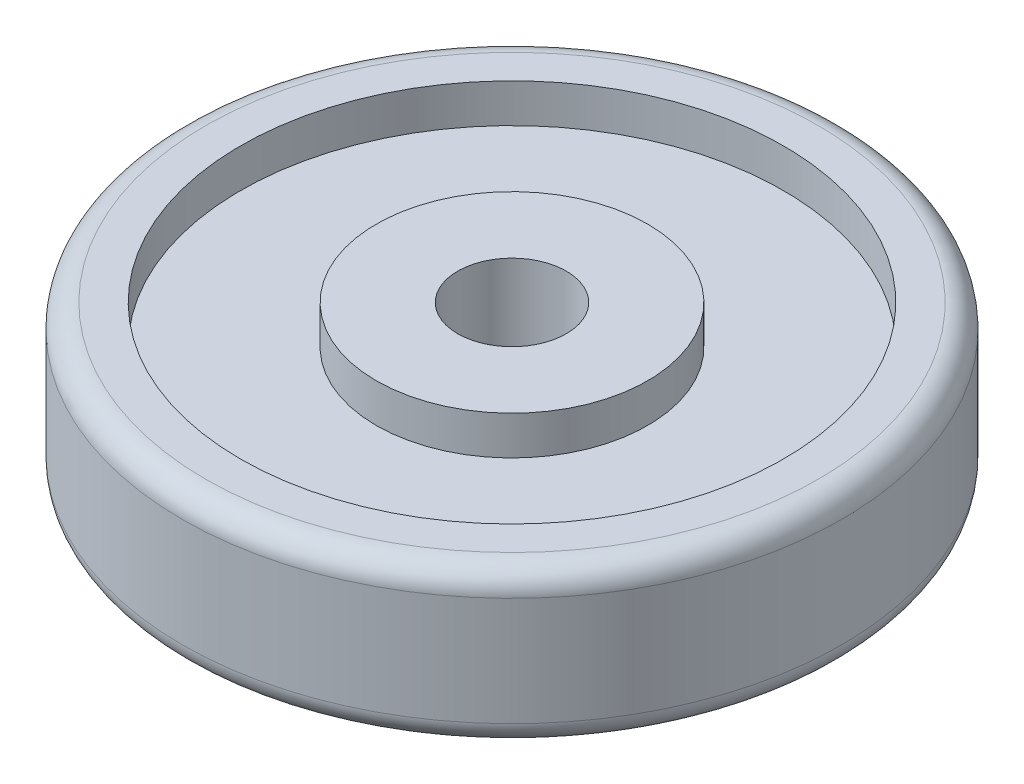
ISO-10303-21;
HEADER;
FILE_DESCRIPTION(('STEP AP214'),'2;1');
FILE_NAME('part.step','',(''),(''),'','','');
FILE_SCHEMA(('AUTOMOTIVE_DESIGN { 1 0 10303 214 1 1 1 1 }'));
ENDSEC;
DATA;
#1=APPLICATION_CONTEXT('core data for automotive mechanical design processes');
#2=APPLICATION_PROTOCOL_DEFINITION('international standard','automotive_design',2000,#1);
#3=PRODUCT_CONTEXT('',#1,'mechanical');
#4=PRODUCT('Part','Part','',(#3));
#5=PRODUCT_RELATED_PRODUCT_CATEGORY('part','',(#4));
#6=PRODUCT_DEFINITION_FORMATION('','',#4);
#7=PRODUCT_DEFINITION_CONTEXT('part definition',#1,'design');
#8=PRODUCT_DEFINITION('design','',#6,#7);
#9=PRODUCT_DEFINITION_SHAPE('','',#8);
#10=(LENGTH_UNIT() NAMED_UNIT(*) SI_UNIT(.MILLI.,.METRE.));
#11=(NAMED_UNIT(*) PLANE_ANGLE_UNIT() SI_UNIT($,.RADIAN.));
#12=(NAMED_UNIT(*) SI_UNIT($,.STERADIAN.) SOLID_ANGLE_UNIT());
#13=UNCERTAINTY_MEASURE_WITH_UNIT(LENGTH_MEASURE(1.E-05),#10,'distance_accuracy_value','');
#14=(GEOMETRIC_REPRESENTATION_CONTEXT(3) GLOBAL_UNCERTAINTY_ASSIGNED_CONTEXT((#13)) GLOBAL_UNIT_ASSIGNED_CONTEXT((#10,
#11,#12)) REPRESENTATION_CONTEXT('',''));
#15=CARTESIAN_POINT('',(0.,0.,0.));
#16=DIRECTION('',(0.,0.,1.));
#17=DIRECTION('',(1.,0.,0.));
#18=AXIS2_PLACEMENT_3D('',#15,#16,#17);
#19=CARTESIAN_POINT('',(0.,0.,0.));
#20=DIRECTION('',(0.,1.,0.));
#21=DIRECTION('',(0.,0.,1.));
#22=AXIS2_PLACEMENT_3D('',#19,#20,#21);
#23=PLANE('',#22);
#24=CARTESIAN_POINT('',(0.,0.,0.));
#25=DIRECTION('',(0.,1.,0.));
#26=DIRECTION('',(0.,0.,1.));
#27=AXIS2_PLACEMENT_3D('',#24,#25,#26);
#28=CIRCLE('',#27,7.);
#29=CARTESIAN_POINT('',(0.,0.,7.));
#30=VERTEX_POINT('',#29);
#31=EDGE_CURVE('E53',#30,#30,#28,.T.);
#32=ORIENTED_EDGE('',*,*,#31,.T.);
#33=EDGE_LOOP('',(#32));
#34=FACE_BOUND('',#33,.T.);
#35=CARTESIAN_POINT('',(0.,0.,0.));
#36=DIRECTION('',(0.,-1.,0.));
#37=DIRECTION('',(0.,0.,-1.));
#38=AXIS2_PLACEMENT_3D('',#35,#36,#37);
#39=CIRCLE('',#38,17.5);
#40=CARTESIAN_POINT('',(0.,0.,-17.5));
#41=VERTEX_POINT('',#40);
#42=EDGE_CURVE('E77',#41,#41,#39,.T.);
#43=ORIENTED_EDGE('',*,*,#42,.T.);
#44=EDGE_LOOP('',(#43));
#45=FACE_BOUND('',#44,.T.);
#46=ADVANCED_FACE('F32',(#34,#45),#23,.F.);
#47=CARTESIAN_POINT('',(0.,20.,0.));
#48=DIRECTION('',(0.,1.,0.));
#49=DIRECTION('',(0.,0.,1.));
#50=AXIS2_PLACEMENT_3D('',#47,#48,#49);
#51=PLANE('',#50);
#52=CARTESIAN_POINT('',(0.,20.,0.));
#53=DIRECTION('',(0.,1.,0.));
#54=DIRECTION('',(0.,0.,1.));
#55=AXIS2_PLACEMENT_3D('',#52,#53,#54);
#56=CIRCLE('',#55,7.);
#57=CARTESIAN_POINT('',(0.,20.,7.));
#58=VERTEX_POINT('',#57);
#59=EDGE_CURVE('E52',#58,#58,#56,.T.);
#60=ORIENTED_EDGE('',*,*,#59,.F.);
#61=EDGE_LOOP('',(#60));
#62=FACE_BOUND('',#61,.T.);
#63=CARTESIAN_POINT('',(0.,20.,0.));
#64=DIRECTION('',(0.,1.,0.));
#65=DIRECTION('',(0.,0.,1.));
#66=AXIS2_PLACEMENT_3D('',#63,#64,#65);
#67=CIRCLE('',#66,17.5);
#68=CARTESIAN_POINT('',(0.,20.,17.5));
#69=VERTEX_POINT('',#68);
#70=EDGE_CURVE('E65',#69,#69,#67,.T.);
#71=ORIENTED_EDGE('',*,*,#70,.T.);
#72=EDGE_LOOP('',(#71));
#73=FACE_BOUND('',#72,.T.);
#74=ADVANCED_FACE('F111',(#62,#73),#51,.T.);
#75=CARTESIAN_POINT('',(0.,20.,0.));
#76=DIRECTION('',(0.,1.,0.));
#77=DIRECTION('',(0.,0.,1.));
#78=AXIS2_PLACEMENT_3D('',#75,#76,#77);
#79=CIRCLE('',#78,39.5);
#80=CARTESIAN_POINT('',(0.,20.,39.5));
#81=VERTEX_POINT('',#80);
#82=EDGE_CURVE('E10',#81,#81,#79,.T.);
#83=ORIENTED_EDGE('',*,*,#82,.T.);
#84=EDGE_LOOP('',(#83));
#85=FACE_BOUND('',#84,.T.);
#86=CARTESIAN_POINT('',(0.,20.,0.));
#87=DIRECTION('',(0.,1.,0.));
#88=DIRECTION('',(0.,0.,1.));
#89=AXIS2_PLACEMENT_3D('',#86,#87,#88);
#90=CIRCLE('',#89,35.);
#91=CARTESIAN_POINT('',(0.,20.,35.));
#92=VERTEX_POINT('',#91);
#93=EDGE_CURVE('E59',#92,#92,#90,.T.);
#94=ORIENTED_EDGE('',*,*,#93,.F.);
#95=EDGE_LOOP('',(#94));
#96=FACE_BOUND('',#95,.T.);
#97=ADVANCED_FACE('F102',(#85,#96),#51,.T.);
#98=CARTESIAN_POINT('',(0.,0.,0.));
#99=DIRECTION('',(0.,1.,0.));
#100=DIRECTION('',(0.,0.,1.));
#101=AXIS2_PLACEMENT_3D('',#98,#99,#100);
#102=CIRCLE('',#101,39.5);
#103=CARTESIAN_POINT('',(0.,0.,39.5));
#104=VERTEX_POINT('',#103);
#105=EDGE_CURVE('E39',#104,#104,#102,.F.);
#106=ORIENTED_EDGE('',*,*,#105,.T.);
#107=EDGE_LOOP('',(#106));
#108=FACE_BOUND('',#107,.T.);
#109=CARTESIAN_POINT('',(0.,0.,0.));
#110=DIRECTION('',(0.,-1.,0.));
#111=DIRECTION('',(0.,0.,-1.));
#112=AXIS2_PLACEMENT_3D('',#109,#110,#111);
#113=CIRCLE('',#112,35.);
#114=CARTESIAN_POINT('',(0.,0.,-35.));
#115=VERTEX_POINT('',#114);
#116=EDGE_CURVE('E71',#115,#115,#113,.T.);
#117=ORIENTED_EDGE('',*,*,#116,.F.);
#118=EDGE_LOOP('',(#117));
#119=FACE_BOUND('',#118,.T.);
#120=ADVANCED_FACE('F99',(#108,#119),#23,.F.);
#121=CARTESIAN_POINT('',(0.,20.,0.));
#122=DIRECTION('',(0.,-1.,0.));
#123=DIRECTION('',(0.,0.,-1.));
#124=AXIS2_PLACEMENT_3D('',#121,#122,#123);
#125=CYLINDRICAL_SURFACE('',#124,42.5);
#126=CARTESIAN_POINT('',(0.,3.,0.));
#127=DIRECTION('',(0.,1.,0.));
#128=DIRECTION('',(0.,0.,1.));
#129=AXIS2_PLACEMENT_3D('',#126,#127,#128);
#130=CIRCLE('',#129,42.5);
#131=CARTESIAN_POINT('',(0.,3.,42.5));
#132=VERTEX_POINT('',#131);
#133=EDGE_CURVE('E43',#132,#132,#130,.T.);
#134=ORIENTED_EDGE('',*,*,#133,.T.);
#135=EDGE_LOOP('',(#134));
#136=FACE_BOUND('',#135,.T.);
#137=CARTESIAN_POINT('',(0.,17.,0.));
#138=DIRECTION('',(0.,1.,0.));
#139=DIRECTION('',(0.,0.,1.));
#140=AXIS2_PLACEMENT_3D('',#137,#138,#139);
#141=CIRCLE('',#140,42.5);
#142=CARTESIAN_POINT('',(0.,17.,42.5));
#143=VERTEX_POINT('',#142);
#144=EDGE_CURVE('E47',#143,#143,#141,.F.);
#145=ORIENTED_EDGE('',*,*,#144,.T.);
#146=EDGE_LOOP('',(#145));
#147=FACE_BOUND('',#146,.T.);
#148=ADVANCED_FACE('F101',(#136,#147),#125,.T.);
#149=CARTESIAN_POINT('',(0.,20.,0.));
#150=DIRECTION('',(0.,-1.,0.));
#151=DIRECTION('',(0.,0.,-1.));
#152=AXIS2_PLACEMENT_3D('',#149,#150,#151);
#153=CYLINDRICAL_SURFACE('',#152,7.);
#154=ORIENTED_EDGE('',*,*,#59,.T.);
#155=EDGE_LOOP('',(#154));
#156=FACE_BOUND('',#155,.T.);
#157=ORIENTED_EDGE('',*,*,#31,.F.);
#158=EDGE_LOOP('',(#157));
#159=FACE_BOUND('',#158,.T.);
#160=ADVANCED_FACE('F108',(#156,#159),#153,.F.);
#161=CARTESIAN_POINT('',(0.,15.,0.));
#162=DIRECTION('',(0.,1.,0.));
#163=DIRECTION('',(0.,0.,1.));
#164=AXIS2_PLACEMENT_3D('',#161,#162,#163);
#165=CYLINDRICAL_SURFACE('',#164,35.);
#166=CARTESIAN_POINT('',(0.,15.,0.));
#167=DIRECTION('',(0.,1.,0.));
#168=DIRECTION('',(0.,0.,1.));
#169=AXIS2_PLACEMENT_3D('',#166,#167,#168);
#170=CIRCLE('',#169,35.);
#171=CARTESIAN_POINT('',(0.,15.,35.));
#172=VERTEX_POINT('',#171);
#173=EDGE_CURVE('E56',#172,#172,#170,.T.);
#174=ORIENTED_EDGE('',*,*,#173,.F.);
#175=EDGE_LOOP('',(#174));
#176=FACE_BOUND('',#175,.T.);
#177=ORIENTED_EDGE('',*,*,#93,.T.);
#178=EDGE_LOOP('',(#177));
#179=FACE_BOUND('',#178,.T.);
#180=ADVANCED_FACE('F136',(#176,#179),#165,.F.);
#181=CARTESIAN_POINT('',(0.,15.,0.));
#182=DIRECTION('',(0.,1.,0.));
#183=DIRECTION('',(0.,0.,1.));
#184=AXIS2_PLACEMENT_3D('',#181,#182,#183);
#185=PLANE('',#184);
#186=CARTESIAN_POINT('',(0.,15.,0.));
#187=DIRECTION('',(0.,1.,0.));
#188=DIRECTION('',(0.,0.,1.));
#189=AXIS2_PLACEMENT_3D('',#186,#187,#188);
#190=CIRCLE('',#189,17.5);
#191=CARTESIAN_POINT('',(0.,15.,17.5));
#192=VERTEX_POINT('',#191);
#193=EDGE_CURVE('E62',#192,#192,#190,.T.);
#194=ORIENTED_EDGE('',*,*,#193,.F.);
#195=EDGE_LOOP('',(#194));
#196=FACE_BOUND('',#195,.T.);
#197=ORIENTED_EDGE('',*,*,#173,.T.);
#198=EDGE_LOOP('',(#197));
#199=FACE_BOUND('',#198,.T.);
#200=ADVANCED_FACE('F132',(#196,#199),#185,.T.);
#201=CARTESIAN_POINT('',(0.,15.,0.));
#202=DIRECTION('',(0.,1.,0.));
#203=DIRECTION('',(0.,0.,1.));
#204=AXIS2_PLACEMENT_3D('',#201,#202,#203);
#205=CYLINDRICAL_SURFACE('',#204,17.5);
#206=ORIENTED_EDGE('',*,*,#193,.T.);
#207=EDGE_LOOP('',(#206));
#208=FACE_BOUND('',#207,.T.);
#209=ORIENTED_EDGE('',*,*,#70,.F.);
#210=EDGE_LOOP('',(#209));
#211=FACE_BOUND('',#210,.T.);
#212=ADVANCED_FACE('F95',(#208,#211),#205,.T.);
#213=CARTESIAN_POINT('',(0.,5.,0.));
#214=DIRECTION('',(0.,-1.,0.));
#215=DIRECTION('',(0.,0.,-1.));
#216=AXIS2_PLACEMENT_3D('',#213,#214,#215);
#217=CYLINDRICAL_SURFACE('',#216,35.);
#218=CARTESIAN_POINT('',(0.,5.,0.));
#219=DIRECTION('',(0.,-1.,0.));
#220=DIRECTION('',(0.,0.,-1.));
#221=AXIS2_PLACEMENT_3D('',#218,#219,#220);
#222=CIRCLE('',#221,35.);
#223=CARTESIAN_POINT('',(0.,5.,-35.));
#224=VERTEX_POINT('',#223);
#225=EDGE_CURVE('E68',#224,#224,#222,.T.);
#226=ORIENTED_EDGE('',*,*,#225,.F.);
#227=EDGE_LOOP('',(#226));
#228=FACE_BOUND('',#227,.T.);
#229=ORIENTED_EDGE('',*,*,#116,.T.);
#230=EDGE_LOOP('',(#229));
#231=FACE_BOUND('',#230,.T.);
#232=ADVANCED_FACE('F89',(#228,#231),#217,.F.);
#233=CARTESIAN_POINT('',(0.,5.,0.));
#234=DIRECTION('',(0.,-1.,0.));
#235=DIRECTION('',(0.,0.,-1.));
#236=AXIS2_PLACEMENT_3D('',#233,#234,#235);
#237=PLANE('',#236);
#238=CARTESIAN_POINT('',(0.,5.,0.));
#239=DIRECTION('',(0.,-1.,0.));
#240=DIRECTION('',(0.,0.,-1.));
#241=AXIS2_PLACEMENT_3D('',#238,#239,#240);
#242=CIRCLE('',#241,17.5);
#243=CARTESIAN_POINT('',(0.,5.,-17.5));
#244=VERTEX_POINT('',#243);
#245=EDGE_CURVE('E74',#244,#244,#242,.T.);
#246=ORIENTED_EDGE('',*,*,#245,.F.);
#247=EDGE_LOOP('',(#246));
#248=FACE_BOUND('',#247,.T.);
#249=ORIENTED_EDGE('',*,*,#225,.T.);
#250=EDGE_LOOP('',(#249));
#251=FACE_BOUND('',#250,.T.);
#252=ADVANCED_FACE('F86',(#248,#251),#237,.T.);
#253=CARTESIAN_POINT('',(0.,5.,0.));
#254=DIRECTION('',(0.,-1.,0.));
#255=DIRECTION('',(0.,0.,-1.));
#256=AXIS2_PLACEMENT_3D('',#253,#254,#255);
#257=CYLINDRICAL_SURFACE('',#256,17.5);
#258=ORIENTED_EDGE('',*,*,#245,.T.);
#259=EDGE_LOOP('',(#258));
#260=FACE_BOUND('',#259,.T.);
#261=ORIENTED_EDGE('',*,*,#42,.F.);
#262=EDGE_LOOP('',(#261));
#263=FACE_BOUND('',#262,.T.);
#264=ADVANCED_FACE('F83',(#260,#263),#257,.T.);
#265=CARTESIAN_POINT('',(0.,3.,0.));
#266=DIRECTION('',(0.,1.,0.));
#267=DIRECTION('',(0.,0.,1.));
#268=AXIS2_PLACEMENT_3D('',#265,#266,#267);
#269=TOROIDAL_SURFACE('',#268,39.5,3.);
#270=ORIENTED_EDGE('',*,*,#105,.F.);
#271=EDGE_LOOP('',(#270));
#272=FACE_BOUND('',#271,.T.);
#273=ORIENTED_EDGE('',*,*,#133,.F.);
#274=EDGE_LOOP('',(#273));
#275=FACE_BOUND('',#274,.T.);
#276=ADVANCED_FACE('F123',(#272,#275),#269,.T.);
#277=CARTESIAN_POINT('',(0.,17.,0.));
#278=DIRECTION('',(0.,1.,0.));
#279=DIRECTION('',(0.,0.,1.));
#280=AXIS2_PLACEMENT_3D('',#277,#278,#279);
#281=TOROIDAL_SURFACE('',#280,39.5,3.);
#282=ORIENTED_EDGE('',*,*,#144,.F.);
#283=EDGE_LOOP('',(#282));
#284=FACE_BOUND('',#283,.T.);
#285=ORIENTED_EDGE('',*,*,#82,.F.);
#286=EDGE_LOOP('',(#285));
#287=FACE_BOUND('',#286,.T.);
#288=ADVANCED_FACE('F34',(#284,#287),#281,.T.);
#289=CLOSED_SHELL('',(#46,#74,#97,#120,#148,#160,#180,#200,#212,#232,#252,#264,#276,#288));
#290=MANIFOLD_SOLID_BREP('B2',#289);
#291=ADVANCED_BREP_SHAPE_REPRESENTATION('',(#18,#290),#14);
#292=SHAPE_DEFINITION_REPRESENTATION(#9,#291);
ENDSEC;
END-ISO-10303-21;
